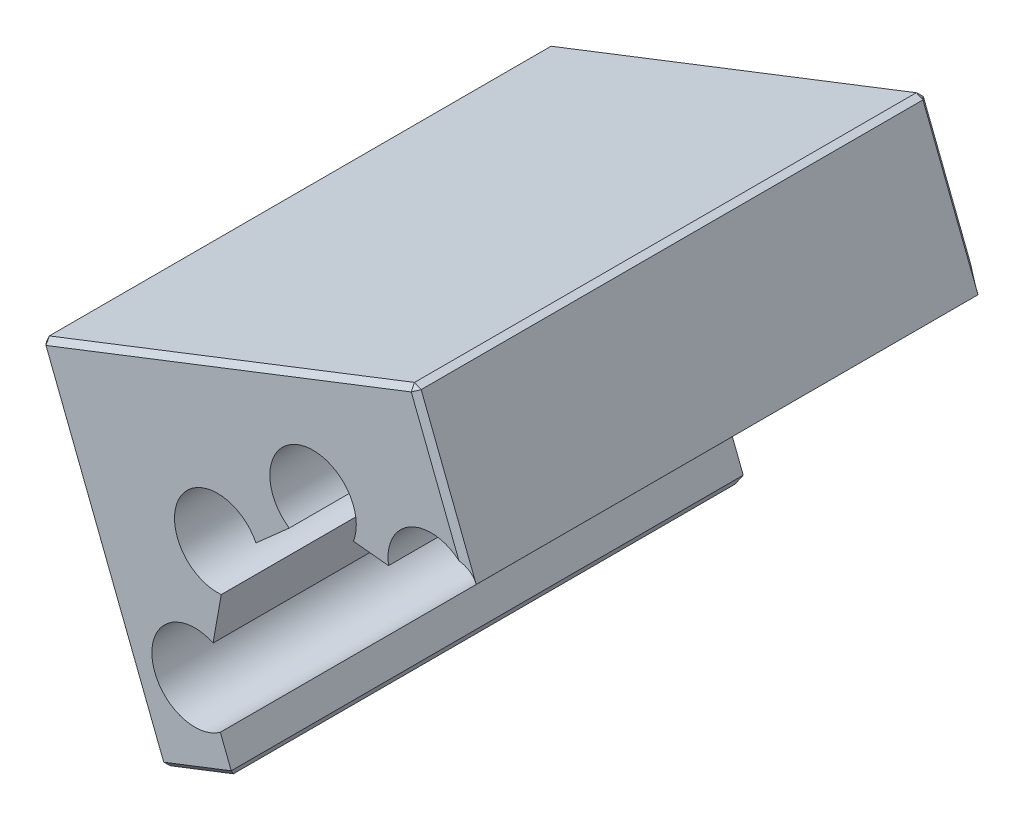
ISO-10303-21;
HEADER;
FILE_DESCRIPTION(('STEP AP214'),'2;1');
FILE_NAME('part.step','',(''),(''),'','','');
FILE_SCHEMA(('AUTOMOTIVE_DESIGN { 1 0 10303 214 1 1 1 1 }'));
ENDSEC;
DATA;
#1=APPLICATION_CONTEXT('core data for automotive mechanical design processes');
#2=APPLICATION_PROTOCOL_DEFINITION('international standard','automotive_design',2000,#1);
#3=PRODUCT_CONTEXT('',#1,'mechanical');
#4=PRODUCT('Part','Part','',(#3));
#5=PRODUCT_RELATED_PRODUCT_CATEGORY('part','',(#4));
#6=PRODUCT_DEFINITION_FORMATION('','',#4);
#7=PRODUCT_DEFINITION_CONTEXT('part definition',#1,'design');
#8=PRODUCT_DEFINITION('design','',#6,#7);
#9=PRODUCT_DEFINITION_SHAPE('','',#8);
#10=(LENGTH_UNIT() NAMED_UNIT(*) SI_UNIT(.MILLI.,.METRE.));
#11=(NAMED_UNIT(*) PLANE_ANGLE_UNIT() SI_UNIT($,.RADIAN.));
#12=(NAMED_UNIT(*) SI_UNIT($,.STERADIAN.) SOLID_ANGLE_UNIT());
#13=UNCERTAINTY_MEASURE_WITH_UNIT(LENGTH_MEASURE(1.E-05),#10,'distance_accuracy_value','');
#14=(GEOMETRIC_REPRESENTATION_CONTEXT(3) GLOBAL_UNCERTAINTY_ASSIGNED_CONTEXT((#13)) GLOBAL_UNIT_ASSIGNED_CONTEXT((#10,
#11,#12)) REPRESENTATION_CONTEXT('',''));
#15=CARTESIAN_POINT('',(0.,0.,0.));
#16=DIRECTION('',(0.,0.,1.));
#17=DIRECTION('',(1.,0.,0.));
#18=AXIS2_PLACEMENT_3D('',#15,#16,#17);
#19=CARTESIAN_POINT('',(-109.956011221457,-32.2462508840964,12577.7351284571));
#20=DIRECTION('',(0.,0.,1.));
#21=DIRECTION('',(1.,0.,0.));
#22=AXIS2_PLACEMENT_3D('',#19,#20,#21);
#23=CYLINDRICAL_SURFACE('',#22,21.);
#24=CARTESIAN_POINT('',(-109.956011221457,-32.2462508840964,12827.7351284571));
#25=DIRECTION('',(0.,0.,-1.));
#26=DIRECTION('',(1.,0.,0.));
#27=AXIS2_PLACEMENT_3D('',#24,#25,#26);
#28=CIRCLE('',#27,21.);
#29=CARTESIAN_POINT('',(-108.139732901133,-53.1675589948031,12827.7351284571));
#30=VERTEX_POINT('',#29);
#31=CARTESIAN_POINT('',(-91.1814690200371,-22.8379266376059,12827.7351284571));
#32=VERTEX_POINT('',#31);
#33=EDGE_CURVE('E213',#30,#32,#28,.T.);
#34=ORIENTED_EDGE('',*,*,#33,.F.);
#35=DIRECTION('',(0.,0.,1.));
#36=VECTOR('',#35,1.);
#37=CARTESIAN_POINT('',(-108.139732901133,-53.1675589948031,12577.7351284571));
#38=LINE('',#37,#36);
#39=CARTESIAN_POINT('',(-108.139732901133,-53.1675589948031,12577.7351284571));
#40=VERTEX_POINT('',#39);
#41=EDGE_CURVE('E193',#40,#30,#38,.T.);
#42=ORIENTED_EDGE('',*,*,#41,.F.);
#43=CARTESIAN_POINT('',(-109.956011221457,-32.2462508840964,12577.7351284571));
#44=DIRECTION('',(0.,0.,-1.));
#45=DIRECTION('',(1.,0.,0.));
#46=AXIS2_PLACEMENT_3D('',#43,#44,#45);
#47=CIRCLE('',#46,21.);
#48=CARTESIAN_POINT('',(-91.1814690200371,-22.8379266376059,12577.7351284571));
#49=VERTEX_POINT('',#48);
#50=EDGE_CURVE('E187',#40,#49,#47,.T.);
#51=ORIENTED_EDGE('',*,*,#50,.T.);
#52=DIRECTION('',(0.,0.,1.));
#53=VECTOR('',#52,1.);
#54=CARTESIAN_POINT('',(-91.1814690200371,-22.8379266376059,12577.7351284571));
#55=LINE('',#54,#53);
#56=EDGE_CURVE('E168',#49,#32,#55,.T.);
#57=ORIENTED_EDGE('',*,*,#56,.T.);
#58=EDGE_LOOP('',(#34,#42,#51,#57));
#59=FACE_BOUND('',#58,.T.);
#60=ADVANCED_FACE('F33',(#59),#23,.F.);
#61=CARTESIAN_POINT('',(-112.117770631375,-75.640230506587,12577.7351284571));
#62=DIRECTION('',(0.984691392589964,-0.174306802389456,0.));
#63=DIRECTION('',(0.174306802389456,0.984691392589964,0.));
#64=AXIS2_PLACEMENT_3D('',#61,#62,#63);
#65=PLANE('',#64);
#66=DIRECTION('',(0.174306802389456,0.984691392589964,0.));
#67=VECTOR('',#66,1.);
#68=CARTESIAN_POINT('',(-112.117770631375,-75.640230506587,12827.7351284571));
#69=LINE('',#68,#67);
#70=CARTESIAN_POINT('',(-112.117770631375,-75.640230506587,12827.7351284571));
#71=VERTEX_POINT('',#70);
#72=EDGE_CURVE('E194',#71,#30,#69,.T.);
#73=ORIENTED_EDGE('',*,*,#72,.F.);
#74=DIRECTION('',(0.,0.,1.));
#75=VECTOR('',#74,1.);
#76=CARTESIAN_POINT('',(-112.117770631375,-75.640230506587,12577.7351284571));
#77=LINE('',#76,#75);
#78=CARTESIAN_POINT('',(-112.117770631375,-75.640230506587,12577.7351284571));
#79=VERTEX_POINT('',#78);
#80=EDGE_CURVE('E231',#79,#71,#77,.T.);
#81=ORIENTED_EDGE('',*,*,#80,.F.);
#82=DIRECTION('',(0.174306802389456,0.984691392589964,0.));
#83=VECTOR('',#82,1.);
#84=CARTESIAN_POINT('',(-112.117770631375,-75.640230506587,12577.7351284571));
#85=LINE('',#84,#83);
#86=EDGE_CURVE('E179',#79,#40,#85,.T.);
#87=ORIENTED_EDGE('',*,*,#86,.T.);
#88=ORIENTED_EDGE('',*,*,#41,.T.);
#89=EDGE_LOOP('',(#73,#81,#87,#88));
#90=FACE_BOUND('',#89,.T.);
#91=ADVANCED_FACE('F394',(#90),#65,.T.);
#92=CARTESIAN_POINT('',(-121.005481520985,-94.6667539710225,12577.7351284571));
#93=DIRECTION('',(0.,0.,1.));
#94=DIRECTION('',(1.,0.,0.));
#95=AXIS2_PLACEMENT_3D('',#92,#93,#94);
#96=CYLINDRICAL_SURFACE('',#95,21.);
#97=CARTESIAN_POINT('',(-121.005481520985,-94.6667539710225,12827.7351284571));
#98=DIRECTION('',(0.,0.,-1.));
#99=DIRECTION('',(1.,0.,0.));
#100=AXIS2_PLACEMENT_3D('',#97,#98,#99);
#101=CIRCLE('',#100,21.);
#102=CARTESIAN_POINT('',(-108.575356239287,-111.592828101822,12827.7351284571));
#103=VERTEX_POINT('',#102);
#104=EDGE_CURVE('E197',#103,#71,#101,.T.);
#105=ORIENTED_EDGE('',*,*,#104,.F.);
#106=DIRECTION('',(0.,0.,1.));
#107=VECTOR('',#106,1.);
#108=CARTESIAN_POINT('',(-108.575356239287,-111.592828101822,12577.7351284571));
#109=LINE('',#108,#107);
#110=CARTESIAN_POINT('',(-108.575356239287,-111.592828101822,12577.7351284571));
#111=VERTEX_POINT('',#110);
#112=EDGE_CURVE('E233',#111,#103,#109,.T.);
#113=ORIENTED_EDGE('',*,*,#112,.F.);
#114=CARTESIAN_POINT('',(-121.005481520985,-94.6667539710225,12577.7351284571));
#115=DIRECTION('',(0.,0.,-1.));
#116=DIRECTION('',(1.,0.,0.));
#117=AXIS2_PLACEMENT_3D('',#114,#115,#116);
#118=CIRCLE('',#117,21.);
#119=EDGE_CURVE('E209',#111,#79,#118,.T.);
#120=ORIENTED_EDGE('',*,*,#119,.T.);
#121=ORIENTED_EDGE('',*,*,#80,.T.);
#122=EDGE_LOOP('',(#105,#113,#120,#121));
#123=FACE_BOUND('',#122,.T.);
#124=ADVANCED_FACE('F390',(#123),#96,.F.);
#125=CARTESIAN_POINT('',(-108.575356239287,-111.592828101822,12577.7351284571));
#126=DIRECTION('',(0.931737395073137,0.363132794749145,0.));
#127=DIRECTION('',(-0.363132794749145,0.931737395073137,0.));
#128=AXIS2_PLACEMENT_3D('',#125,#126,#127);
#129=PLANE('',#128);
#130=DIRECTION('',(-0.363132794749145,0.931737395073137,0.));
#131=VECTOR('',#130,1.);
#132=CARTESIAN_POINT('',(-108.575356239287,-111.592828101822,12827.7351284571));
#133=LINE('',#132,#131);
#134=CARTESIAN_POINT('',(-103.259247393131,-125.233065171749,12827.7351284571));
#135=VERTEX_POINT('',#134);
#136=EDGE_CURVE('E225',#135,#103,#133,.T.);
#137=ORIENTED_EDGE('',*,*,#136,.F.);
#138=DIRECTION('',(0.,0.,-1.));
#139=VECTOR('',#138,1.);
#140=CARTESIAN_POINT('',(-103.25924739313,-125.233065171749,12577.7351284571));
#141=LINE('',#140,#139);
#142=CARTESIAN_POINT('',(-103.25924739313,-125.233065171749,12577.7351284571));
#143=VERTEX_POINT('',#142);
#144=EDGE_CURVE('E288',#135,#143,#141,.T.);
#145=ORIENTED_EDGE('',*,*,#144,.T.);
#146=DIRECTION('',(-0.363132794749145,0.931737395073137,0.));
#147=VECTOR('',#146,1.);
#148=CARTESIAN_POINT('',(-108.575356239287,-111.592828101822,12577.7351284571));
#149=LINE('',#148,#147);
#150=EDGE_CURVE('E207',#143,#111,#149,.T.);
#151=ORIENTED_EDGE('',*,*,#150,.T.);
#152=ORIENTED_EDGE('',*,*,#112,.T.);
#153=EDGE_LOOP('',(#137,#145,#151,#152));
#154=FACE_BOUND('',#153,.T.);
#155=ADVANCED_FACE('F385',(#154),#129,.T.);
#156=CARTESIAN_POINT('',(-102.351415406258,-127.562408659431,12577.7351284571));
#157=DIRECTION('',(0.363132794749145,-0.931737395073137,0.));
#158=DIRECTION('',(0.931737395073137,0.363132794749145,0.));
#159=AXIS2_PLACEMENT_3D('',#156,#157,#158);
#160=PLANE('',#159);
#161=DIRECTION('',(0.931737395073137,0.363132794749145,0.));
#162=VECTOR('',#161,1.);
#163=CARTESIAN_POINT('',(-102.351415406258,-127.562408659431,12580.2351284571));
#164=LINE('',#163,#162);
#165=CARTESIAN_POINT('',(-135.309060727003,-140.407231585889,12580.2351284571));
#166=VERTEX_POINT('',#165);
#167=CARTESIAN_POINT('',(-104.680758893941,-128.470240646304,12580.2351284571));
#168=VERTEX_POINT('',#167);
#169=EDGE_CURVE('E283',#166,#168,#164,.T.);
#170=ORIENTED_EDGE('',*,*,#169,.T.);
#171=DIRECTION('',(0.,0.,1.));
#172=VECTOR('',#171,1.);
#173=CARTESIAN_POINT('',(-104.680758893941,-128.470240646304,12577.7351284571));
#174=LINE('',#173,#172);
#175=CARTESIAN_POINT('',(-104.680758893941,-128.470240646304,12825.2351284571));
#176=VERTEX_POINT('',#175);
#177=EDGE_CURVE('E285',#168,#176,#174,.T.);
#178=ORIENTED_EDGE('',*,*,#177,.T.);
#179=DIRECTION('',(-0.931737395073137,-0.363132794749145,0.));
#180=VECTOR('',#179,1.);
#181=CARTESIAN_POINT('',(-102.351415406258,-127.562408659431,12825.2351284571));
#182=LINE('',#181,#180);
#183=CARTESIAN_POINT('',(-135.309060727003,-140.407231585889,12825.2351284571));
#184=VERTEX_POINT('',#183);
#185=EDGE_CURVE('E279',#176,#184,#182,.T.);
#186=ORIENTED_EDGE('',*,*,#185,.T.);
#187=DIRECTION('',(0.,0.,-1.));
#188=VECTOR('',#187,1.);
#189=CARTESIAN_POINT('',(-135.309060727003,-140.407231585889,12577.7351284571));
#190=LINE('',#189,#188);
#191=EDGE_CURVE('E281',#184,#166,#190,.T.);
#192=ORIENTED_EDGE('',*,*,#191,.T.);
#193=EDGE_LOOP('',(#170,#178,#186,#192));
#194=FACE_BOUND('',#193,.T.);
#195=ADVANCED_FACE('F374',(#194),#160,.T.);
#196=CARTESIAN_POINT('',(-137.638404214685,-141.315063572762,12577.7351284571));
#197=DIRECTION('',(-0.931737395073137,-0.363132794749145,0.));
#198=DIRECTION('',(0.363132794749145,-0.931737395073137,0.));
#199=AXIS2_PLACEMENT_3D('',#196,#197,#198);
#200=PLANE('',#199);
#201=DIRECTION('',(0.,0.,-1.));
#202=VECTOR('',#201,1.);
#203=CARTESIAN_POINT('',(-196.025233475658,8.4956750573858,12577.7351284571));
#204=LINE('',#203,#202);
#205=CARTESIAN_POINT('',(-196.025233475658,8.49567505738577,12825.2351284571));
#206=VERTEX_POINT('',#205);
#207=CARTESIAN_POINT('',(-196.025233475658,8.49567505738576,12580.2351284571));
#208=VERTEX_POINT('',#207);
#209=EDGE_CURVE('E274',#206,#208,#204,.T.);
#210=ORIENTED_EDGE('',*,*,#209,.T.);
#211=DIRECTION('',(0.363132794749145,-0.931737395073137,0.));
#212=VECTOR('',#211,1.);
#213=CARTESIAN_POINT('',(-137.638404214685,-141.315063572762,12580.2351284571));
#214=LINE('',#213,#212);
#215=CARTESIAN_POINT('',(-138.546236201558,-138.985720085079,12580.2351284571));
#216=VERTEX_POINT('',#215);
#217=EDGE_CURVE('E276',#208,#216,#214,.T.);
#218=ORIENTED_EDGE('',*,*,#217,.T.);
#219=DIRECTION('',(0.,0.,1.));
#220=VECTOR('',#219,1.);
#221=CARTESIAN_POINT('',(-138.546236201558,-138.985720085079,12577.7351284571));
#222=LINE('',#221,#220);
#223=CARTESIAN_POINT('',(-138.546236201558,-138.985720085079,12825.2351284571));
#224=VERTEX_POINT('',#223);
#225=EDGE_CURVE('E272',#216,#224,#222,.T.);
#226=ORIENTED_EDGE('',*,*,#225,.T.);
#227=DIRECTION('',(-0.363132794749145,0.931737395073137,0.));
#228=VECTOR('',#227,1.);
#229=CARTESIAN_POINT('',(-137.638404214685,-141.315063572762,12825.2351284571));
#230=LINE('',#229,#228);
#231=EDGE_CURVE('E270',#224,#206,#230,.T.);
#232=ORIENTED_EDGE('',*,*,#231,.T.);
#233=EDGE_LOOP('',(#210,#218,#226,#232));
#234=FACE_BOUND('',#233,.T.);
#235=ADVANCED_FACE('F365',(#234),#200,.T.);
#236=CARTESIAN_POINT('',(-196.933065462531,10.8250185450681,12577.7351284571));
#237=DIRECTION('',(-0.363132794749144,0.931737395073138,0.));
#238=DIRECTION('',(-0.931737395073138,-0.363132794749144,0.));
#239=AXIS2_PLACEMENT_3D('',#236,#237,#238);
#240=PLANE('',#239);
#241=DIRECTION('',(0.,0.,-1.));
#242=VECTOR('',#241,1.);
#243=CARTESIAN_POINT('',(-16.258858059274,81.2404920683576,12577.7351284571));
#244=LINE('',#243,#242);
#245=CARTESIAN_POINT('',(-16.2588580592739,81.2404920683576,12825.2351284571));
#246=VERTEX_POINT('',#245);
#247=CARTESIAN_POINT('',(-16.2588580592739,81.2404920683576,12580.2351284571));
#248=VERTEX_POINT('',#247);
#249=EDGE_CURVE('E247',#246,#248,#244,.T.);
#250=ORIENTED_EDGE('',*,*,#249,.T.);
#251=DIRECTION('',(-0.931737395073138,-0.363132794749144,0.));
#252=VECTOR('',#251,1.);
#253=CARTESIAN_POINT('',(-196.933065462531,10.8250185450681,12580.2351284571));
#254=LINE('',#253,#252);
#255=CARTESIAN_POINT('',(-194.603721974848,11.7328505319409,12580.2351284571));
#256=VERTEX_POINT('',#255);
#257=EDGE_CURVE('E249',#248,#256,#254,.T.);
#258=ORIENTED_EDGE('',*,*,#257,.T.);
#259=DIRECTION('',(0.,0.,1.));
#260=VECTOR('',#259,1.);
#261=CARTESIAN_POINT('',(-194.603721974848,11.7328505319409,12577.7351284571));
#262=LINE('',#261,#260);
#263=CARTESIAN_POINT('',(-194.603721974848,11.7328505319409,12825.2351284571));
#264=VERTEX_POINT('',#263);
#265=EDGE_CURVE('E245',#256,#264,#262,.T.);
#266=ORIENTED_EDGE('',*,*,#265,.T.);
#267=DIRECTION('',(0.931737395073138,0.363132794749144,0.));
#268=VECTOR('',#267,1.);
#269=CARTESIAN_POINT('',(-196.933065462531,10.8250185450681,12825.2351284571));
#270=LINE('',#269,#268);
#271=EDGE_CURVE('E230',#264,#246,#270,.T.);
#272=ORIENTED_EDGE('',*,*,#271,.T.);
#273=EDGE_LOOP('',(#250,#258,#266,#272));
#274=FACE_BOUND('',#273,.T.);
#275=ADVANCED_FACE('F451',(#274),#240,.T.);
#276=CARTESIAN_POINT('',(13.8575829658257,10.8513267844628,12577.7351284571));
#277=DIRECTION('',(0.931737395073137,0.363132794749145,0.));
#278=DIRECTION('',(-0.363132794749145,0.931737395073137,0.));
#279=AXIS2_PLACEMENT_3D('',#276,#277,#278);
#280=PLANE('',#279);
#281=DIRECTION('',(0.,0.,1.));
#282=VECTOR('',#281,1.);
#283=CARTESIAN_POINT('',(13.8575829658257,10.8513267844628,12577.7351284571));
#284=LINE('',#283,#282);
#285=CARTESIAN_POINT('',(13.8575829658257,10.8513267844628,12580.2351284571));
#286=VERTEX_POINT('',#285);
#287=CARTESIAN_POINT('',(13.8575829658257,10.8513267844628,12825.2351284571));
#288=VERTEX_POINT('',#287);
#289=EDGE_CURVE('E236',#286,#288,#284,.T.);
#290=ORIENTED_EDGE('',*,*,#289,.F.);
#291=DIRECTION('',(-0.363132794749145,0.931737395073137,0.));
#292=VECTOR('',#291,1.);
#293=CARTESIAN_POINT('',(-13.9295145715912,82.1483240552304,12580.2351284571));
#294=LINE('',#293,#292);
#295=CARTESIAN_POINT('',(-13.0216825847185,79.8189805675481,12580.2351284571));
#296=VERTEX_POINT('',#295);
#297=EDGE_CURVE('E264',#286,#296,#294,.T.);
#298=ORIENTED_EDGE('',*,*,#297,.T.);
#299=DIRECTION('',(0.,0.,1.));
#300=VECTOR('',#299,1.);
#301=CARTESIAN_POINT('',(-13.0216825847185,79.8189805675481,12577.7351284571));
#302=LINE('',#301,#300);
#303=CARTESIAN_POINT('',(-13.0216825847185,79.8189805675481,12825.2351284571));
#304=VERTEX_POINT('',#303);
#305=EDGE_CURVE('E262',#296,#304,#302,.T.);
#306=ORIENTED_EDGE('',*,*,#305,.T.);
#307=DIRECTION('',(0.363132794749145,-0.931737395073137,0.));
#308=VECTOR('',#307,1.);
#309=CARTESIAN_POINT('',(13.8575829658257,10.8513267844628,12825.2351284571));
#310=LINE('',#309,#308);
#311=EDGE_CURVE('E260',#304,#288,#310,.T.);
#312=ORIENTED_EDGE('',*,*,#311,.T.);
#313=EDGE_LOOP('',(#290,#298,#306,#312));
#314=FACE_BOUND('',#313,.T.);
#315=ADVANCED_FACE('F446',(#314),#280,.T.);
#316=CARTESIAN_POINT('',(-5.70890233071021,3.22553809473078,12577.7351284571));
#317=DIRECTION('',(0.,0.,1.));
#318=DIRECTION('',(1.,0.,0.));
#319=AXIS2_PLACEMENT_3D('',#316,#317,#318);
#320=CYLINDRICAL_SURFACE('',#319,21.);
#321=CARTESIAN_POINT('',(-5.70890233071021,3.22553809473078,12577.7351284571));
#322=DIRECTION('',(0.,0.,-1.));
#323=DIRECTION('',(1.,0.,0.));
#324=AXIS2_PLACEMENT_3D('',#321,#322,#323);
#325=CIRCLE('',#324,21.);
#326=CARTESIAN_POINT('',(-26.4460123964801,-0.0869030172209947,12577.7351284571));
#327=VERTEX_POINT('',#326);
#328=CARTESIAN_POINT('',(7.91967870146834,19.2024520348302,12577.7351284571));
#329=VERTEX_POINT('',#328);
#330=EDGE_CURVE('E204',#327,#329,#325,.T.);
#331=ORIENTED_EDGE('',*,*,#330,.T.);
#332=CARTESIAN_POINT('',(-5.70890233071021,3.22553809473078,12559.2351284571));
#333=DIRECTION('',(0.658837830341249,0.256773661638321,-0.707106781186608));
#334=DIRECTION('',(0.658837830341361,0.256773661638365,0.707106781186487));
#335=AXIS2_PLACEMENT_3D('',#332,#333,#334);
#336=ELLIPSE('',#335,29.6984848098325,21.);
#337=EDGE_CURVE('E268',#329,#286,#336,.T.);
#338=ORIENTED_EDGE('',*,*,#337,.T.);
#339=ORIENTED_EDGE('',*,*,#289,.T.);
#340=CARTESIAN_POINT('',(-5.70890233071021,3.22553809473078,12846.2351284571));
#341=DIRECTION('',(-0.658837830341249,-0.256773661638321,-0.707106781186608));
#342=DIRECTION('',(-0.658837830341361,-0.256773661638365,0.707106781186487));
#343=AXIS2_PLACEMENT_3D('',#340,#341,#342);
#344=ELLIPSE('',#343,29.6984848098325,21.);
#345=CARTESIAN_POINT('',(7.91967870146834,19.2024520348302,12827.7351284571));
#346=VERTEX_POINT('',#345);
#347=EDGE_CURVE('E266',#288,#346,#344,.F.);
#348=ORIENTED_EDGE('',*,*,#347,.T.);
#349=CARTESIAN_POINT('',(-5.70890233071021,3.22553809473078,12827.7351284571));
#350=DIRECTION('',(0.,0.,-1.));
#351=DIRECTION('',(1.,0.,0.));
#352=AXIS2_PLACEMENT_3D('',#349,#350,#351);
#353=CIRCLE('',#352,21.);
#354=CARTESIAN_POINT('',(-26.4460123964801,-0.0869030172209947,12827.7351284571));
#355=VERTEX_POINT('',#354);
#356=EDGE_CURVE('E222',#355,#346,#353,.T.);
#357=ORIENTED_EDGE('',*,*,#356,.F.);
#358=DIRECTION('',(0.,0.,1.));
#359=VECTOR('',#358,1.);
#360=CARTESIAN_POINT('',(-26.4460123964801,-0.0869030172209947,12577.7351284571));
#361=LINE('',#360,#359);
#362=EDGE_CURVE('E239',#327,#355,#361,.T.);
#363=ORIENTED_EDGE('',*,*,#362,.F.);
#364=EDGE_LOOP('',(#331,#338,#339,#348,#357,#363));
#365=FACE_BOUND('',#364,.T.);
#366=ADVANCED_FACE('F404',(#365),#320,.F.);
#367=CARTESIAN_POINT('',(-43.5798748895795,1.66217030299279,12577.7351284571));
#368=DIRECTION('',(-0.101555062180964,-0.994829919808115,0.));
#369=DIRECTION('',(0.994829919808115,-0.101555062180964,0.));
#370=AXIS2_PLACEMENT_3D('',#367,#368,#369);
#371=PLANE('',#370);
#372=DIRECTION('',(0.994829919808115,-0.101555062180964,0.));
#373=VECTOR('',#372,1.);
#374=CARTESIAN_POINT('',(-43.5798748895795,1.66217030299279,12827.7351284571));
#375=LINE('',#374,#373);
#376=CARTESIAN_POINT('',(-43.5798748895795,1.66217030299279,12827.7351284571));
#377=VERTEX_POINT('',#376);
#378=EDGE_CURVE('E219',#377,#355,#375,.T.);
#379=ORIENTED_EDGE('',*,*,#378,.F.);
#380=DIRECTION('',(0.,0.,1.));
#381=VECTOR('',#380,1.);
#382=CARTESIAN_POINT('',(-43.5798748895795,1.66217030299279,12577.7351284571));
#383=LINE('',#382,#381);
#384=CARTESIAN_POINT('',(-43.5798748895795,1.66217030299279,12577.7351284571));
#385=VERTEX_POINT('',#384);
#386=EDGE_CURVE('E241',#385,#377,#383,.T.);
#387=ORIENTED_EDGE('',*,*,#386,.F.);
#388=DIRECTION('',(0.994829919808115,-0.101555062180964,0.));
#389=VECTOR('',#388,1.);
#390=CARTESIAN_POINT('',(-43.5798748895795,1.66217030299279,12577.7351284571));
#391=LINE('',#390,#389);
#392=EDGE_CURVE('E201',#385,#327,#391,.T.);
#393=ORIENTED_EDGE('',*,*,#392,.T.);
#394=ORIENTED_EDGE('',*,*,#362,.T.);
#395=EDGE_LOOP('',(#379,#387,#393,#394));
#396=FACE_BOUND('',#395,.T.);
#397=ADVANCED_FACE('F400',(#396),#371,.T.);
#398=CARTESIAN_POINT('',(-63.2988923019353,9.20180623385765,12577.7351284571));
#399=DIRECTION('',(0.,0.,1.));
#400=DIRECTION('',(1.,0.,0.));
#401=AXIS2_PLACEMENT_3D('',#398,#399,#400);
#402=CYLINDRICAL_SURFACE('',#401,21.1112708683959);
#403=CARTESIAN_POINT('',(-63.2988923019353,9.20180623385765,12827.7351284571));
#404=DIRECTION('',(0.,0.,-1.));
#405=DIRECTION('',(1.,0.,0.));
#406=AXIS2_PLACEMENT_3D('',#403,#404,#405);
#407=CIRCLE('',#406,21.1112708683959);
#408=CARTESIAN_POINT('',(-74.9151865024779,-8.42622447649749,12827.7351284571));
#409=VERTEX_POINT('',#408);
#410=EDGE_CURVE('E216',#409,#377,#407,.T.);
#411=ORIENTED_EDGE('',*,*,#410,.F.);
#412=DIRECTION('',(0.,0.,1.));
#413=VECTOR('',#412,1.);
#414=CARTESIAN_POINT('',(-74.9151865024779,-8.42622447649749,12577.7351284571));
#415=LINE('',#414,#413);
#416=CARTESIAN_POINT('',(-74.9151865024779,-8.42622447649749,12577.7351284571));
#417=VERTEX_POINT('',#416);
#418=EDGE_CURVE('E178',#417,#409,#415,.T.);
#419=ORIENTED_EDGE('',*,*,#418,.F.);
#420=CARTESIAN_POINT('',(-63.2988923019353,9.20180623385765,12577.7351284571));
#421=DIRECTION('',(0.,0.,-1.));
#422=DIRECTION('',(1.,0.,0.));
#423=AXIS2_PLACEMENT_3D('',#420,#421,#422);
#424=CIRCLE('',#423,21.1112708683959);
#425=EDGE_CURVE('E191',#417,#385,#424,.T.);
#426=ORIENTED_EDGE('',*,*,#425,.T.);
#427=ORIENTED_EDGE('',*,*,#386,.T.);
#428=EDGE_LOOP('',(#411,#419,#426,#427));
#429=FACE_BOUND('',#428,.T.);
#430=ADVANCED_FACE('F398',(#429),#402,.F.);
#431=CARTESIAN_POINT('',(-91.1814690200371,-22.8379266376059,12577.7351284571));
#432=DIRECTION('',(0.663149297828435,-0.748487146709717,0.));
#433=DIRECTION('',(0.748487146709717,0.663149297828435,0.));
#434=AXIS2_PLACEMENT_3D('',#431,#432,#433);
#435=PLANE('',#434);
#436=DIRECTION('',(0.748487146709717,0.663149297828435,0.));
#437=VECTOR('',#436,1.);
#438=CARTESIAN_POINT('',(-91.1814690200371,-22.8379266376059,12827.7351284571));
#439=LINE('',#438,#437);
#440=EDGE_CURVE('E173',#32,#409,#439,.T.);
#441=ORIENTED_EDGE('',*,*,#440,.F.);
#442=ORIENTED_EDGE('',*,*,#56,.F.);
#443=DIRECTION('',(0.748487146709717,0.663149297828435,0.));
#444=VECTOR('',#443,1.);
#445=CARTESIAN_POINT('',(-91.1814690200371,-22.8379266376059,12577.7351284571));
#446=LINE('',#445,#444);
#447=EDGE_CURVE('E171',#49,#417,#446,.T.);
#448=ORIENTED_EDGE('',*,*,#447,.T.);
#449=ORIENTED_EDGE('',*,*,#418,.T.);
#450=EDGE_LOOP('',(#441,#442,#448,#449));
#451=FACE_BOUND('',#450,.T.);
#452=ADVANCED_FACE('F170',(#451),#435,.T.);
#453=CARTESIAN_POINT('',(-109.956011221457,-32.2462508840964,12577.7351284571));
#454=DIRECTION('',(0.,0.,1.));
#455=DIRECTION('',(1.,0.,0.));
#456=AXIS2_PLACEMENT_3D('',#453,#454,#455);
#457=PLANE('',#456);
#458=DIRECTION('',(0.931737395073138,0.363132794749144,0.));
#459=VECTOR('',#458,1.);
#460=CARTESIAN_POINT('',(-13.0216825847185,79.8189805675481,12577.7351284571));
#461=LINE('',#460,#459);
#462=CARTESIAN_POINT('',(-193.695889987976,9.40350704425842,12577.7351284571));
#463=VERTEX_POINT('',#462);
#464=CARTESIAN_POINT('',(-15.3510260724013,78.9111485806752,12577.7351284571));
#465=VERTEX_POINT('',#464);
#466=EDGE_CURVE('E256',#463,#465,#461,.T.);
#467=ORIENTED_EDGE('',*,*,#466,.T.);
#468=DIRECTION('',(0.363132794749145,-0.931737395073137,0.));
#469=VECTOR('',#468,1.);
#470=CARTESIAN_POINT('',(11.5282394781429,9.94349479758998,12577.7351284571));
#471=LINE('',#470,#469);
#472=EDGE_CURVE('E258',#465,#329,#471,.T.);
#473=ORIENTED_EDGE('',*,*,#472,.T.);
#474=ORIENTED_EDGE('',*,*,#330,.F.);
#475=ORIENTED_EDGE('',*,*,#392,.F.);
#476=ORIENTED_EDGE('',*,*,#425,.F.);
#477=ORIENTED_EDGE('',*,*,#447,.F.);
#478=ORIENTED_EDGE('',*,*,#50,.F.);
#479=ORIENTED_EDGE('',*,*,#86,.F.);
#480=ORIENTED_EDGE('',*,*,#119,.F.);
#481=ORIENTED_EDGE('',*,*,#150,.F.);
#482=DIRECTION('',(-0.931737395073137,-0.363132794749145,0.));
#483=VECTOR('',#482,1.);
#484=CARTESIAN_POINT('',(-138.546236201558,-138.985720085079,12577.7351284571));
#485=LINE('',#484,#483);
#486=CARTESIAN_POINT('',(-136.216892713876,-138.077888098207,12577.7351284571));
#487=VERTEX_POINT('',#486);
#488=EDGE_CURVE('E252',#143,#487,#485,.T.);
#489=ORIENTED_EDGE('',*,*,#488,.T.);
#490=DIRECTION('',(-0.363132794749145,0.931737395073137,0.));
#491=VECTOR('',#490,1.);
#492=CARTESIAN_POINT('',(-194.603721974849,11.7328505319408,12577.7351284571));
#493=LINE('',#492,#491);
#494=EDGE_CURVE('E254',#487,#463,#493,.T.);
#495=ORIENTED_EDGE('',*,*,#494,.T.);
#496=EDGE_LOOP('',(#467,#473,#474,#475,#476,#477,#478,#479,#480,#481,#489,#495));
#497=FACE_BOUND('',#496,.T.);
#498=ADVANCED_FACE('F185',(#497),#457,.F.);
#499=CARTESIAN_POINT('',(-109.956011221457,-32.2462508840964,12827.7351284571));
#500=DIRECTION('',(0.,0.,1.));
#501=DIRECTION('',(1.,0.,0.));
#502=AXIS2_PLACEMENT_3D('',#499,#500,#501);
#503=PLANE('',#502);
#504=DIRECTION('',(0.363132794749145,-0.931737395073137,0.));
#505=VECTOR('',#504,1.);
#506=CARTESIAN_POINT('',(-168.561532615901,-55.08700717898,12827.7351284571));
#507=LINE('',#506,#505);
#508=CARTESIAN_POINT('',(-193.695889987975,9.40350704425817,12827.7351284571));
#509=VERTEX_POINT('',#508);
#510=CARTESIAN_POINT('',(-136.216892713875,-138.077888098206,12827.7351284571));
#511=VERTEX_POINT('',#510);
#512=EDGE_CURVE('E42',#509,#511,#507,.T.);
#513=ORIENTED_EDGE('',*,*,#512,.T.);
#514=DIRECTION('',(0.931737395073137,0.363132794749145,0.));
#515=VECTOR('',#514,1.);
#516=CARTESIAN_POINT('',(-77.6113713194314,-115.237131803322,12827.7351284571));
#517=LINE('',#516,#515);
#518=EDGE_CURVE('E11',#511,#135,#517,.T.);
#519=ORIENTED_EDGE('',*,*,#518,.T.);
#520=ORIENTED_EDGE('',*,*,#136,.T.);
#521=ORIENTED_EDGE('',*,*,#104,.T.);
#522=ORIENTED_EDGE('',*,*,#72,.T.);
#523=ORIENTED_EDGE('',*,*,#33,.T.);
#524=ORIENTED_EDGE('',*,*,#440,.T.);
#525=ORIENTED_EDGE('',*,*,#410,.T.);
#526=ORIENTED_EDGE('',*,*,#378,.T.);
#527=ORIENTED_EDGE('',*,*,#356,.T.);
#528=DIRECTION('',(-0.363132794749145,0.931737395073137,0.));
#529=VECTOR('',#528,1.);
#530=CARTESIAN_POINT('',(9.78333129967329,14.4206343574367,12827.7351284571));
#531=LINE('',#530,#529);
#532=CARTESIAN_POINT('',(-15.3510260724011,78.9111485806748,12827.7351284571));
#533=VERTEX_POINT('',#532);
#534=EDGE_CURVE('E290',#346,#533,#531,.T.);
#535=ORIENTED_EDGE('',*,*,#534,.T.);
#536=DIRECTION('',(-0.931737395073138,-0.363132794749144,0.));
#537=VECTOR('',#536,1.);
#538=CARTESIAN_POINT('',(-135.090368593531,32.2442633391417,12827.7351284571));
#539=LINE('',#538,#537);
#540=EDGE_CURVE('E53',#533,#509,#539,.T.);
#541=ORIENTED_EDGE('',*,*,#540,.T.);
#542=EDGE_LOOP('',(#513,#519,#520,#521,#522,#523,#524,#525,#526,#527,#535,#541));
#543=FACE_BOUND('',#542,.T.);
#544=ADVANCED_FACE('F392',(#543),#503,.T.);
#545=CARTESIAN_POINT('',(-77.6113713194314,-115.237131803322,12827.7351284571));
#546=DIRECTION('',(-0.256773661638322,0.658837830341251,-0.707106781186605));
#547=DIRECTION('',(0.931737395073137,0.363132794749145,0.));
#548=AXIS2_PLACEMENT_3D('',#545,#546,#547);
#549=PLANE('',#548);
#550=DIRECTION('',(0.256773661638257,-0.6588378303414,-0.70710678118649));
#551=VECTOR('',#550,1.);
#552=CARTESIAN_POINT('',(-135.762976720439,-139.242559842047,12826.4851284571));
#553=LINE('',#552,#551);
#554=EDGE_CURVE('E37',#184,#511,#553,.F.);
#555=ORIENTED_EDGE('',*,*,#554,.F.);
#556=ORIENTED_EDGE('',*,*,#185,.F.);
#557=DIRECTION('',(0.328284019059607,0.747593652659551,0.57735026918953));
#558=VECTOR('',#557,1.);
#559=CARTESIAN_POINT('',(-98.041933158037,-113.351795357704,12836.9107739445));
#560=LINE('',#559,#558);
#561=EDGE_CURVE('E344',#135,#176,#560,.F.);
#562=ORIENTED_EDGE('',*,*,#561,.F.);
#563=ORIENTED_EDGE('',*,*,#518,.F.);
#564=EDGE_LOOP('',(#555,#556,#562,#563));
#565=FACE_BOUND('',#564,.T.);
#566=ADVANCED_FACE('F35',(#565),#549,.F.);
#567=CARTESIAN_POINT('',(-138.546236201558,-138.985720085079,12825.2351284571));
#568=DIRECTION('',(-0.32828401905955,-0.747593652659429,0.57735026918972));
#569=DIRECTION('',(0.,-0.611224928557175,-0.791456939264718));
#570=AXIS2_PLACEMENT_3D('',#567,#568,#569);
#571=PLANE('',#570);
#572=DIRECTION('',(-0.915611491979615,0.402064168703035,0.));
#573=VECTOR('',#572,1.);
#574=CARTESIAN_POINT('',(-138.546236201558,-138.985720085079,12825.2351284571));
#575=LINE('',#574,#573);
#576=EDGE_CURVE('E339',#184,#224,#575,.T.);
#577=ORIENTED_EDGE('',*,*,#576,.F.);
#578=ORIENTED_EDGE('',*,*,#554,.T.);
#579=DIRECTION('',(0.658837830341355,0.256773661638368,0.707106781186492));
#580=VECTOR('',#579,1.);
#581=CARTESIAN_POINT('',(-138.546236201558,-138.985720085079,12825.2351284571));
#582=LINE('',#581,#580);
#583=EDGE_CURVE('E342',#224,#511,#582,.T.);
#584=ORIENTED_EDGE('',*,*,#583,.F.);
#585=EDGE_LOOP('',(#577,#578,#584));
#586=FACE_BOUND('',#585,.T.);
#587=ADVANCED_FACE('F355',(#586),#571,.T.);
#588=CARTESIAN_POINT('',(-104.680758893941,-128.470240646304,12577.7351284571));
#589=DIRECTION('',(-0.915611491979614,0.402064168703039,0.));
#590=DIRECTION('',(0.,0.,1.));
#591=AXIS2_PLACEMENT_3D('',#588,#589,#590);
#592=PLANE('',#591);
#593=ORIENTED_EDGE('',*,*,#561,.T.);
#594=ORIENTED_EDGE('',*,*,#177,.F.);
#595=DIRECTION('',(0.328284019059589,0.747593652659509,-0.577350269189594));
#596=VECTOR('',#595,1.);
#597=CARTESIAN_POINT('',(-104.206921727004,-127.391182154786,12579.4017951238));
#598=LINE('',#597,#596);
#599=EDGE_CURVE('E336',#143,#168,#598,.F.);
#600=ORIENTED_EDGE('',*,*,#599,.F.);
#601=ORIENTED_EDGE('',*,*,#144,.F.);
#602=EDGE_LOOP('',(#593,#594,#600,#601));
#603=FACE_BOUND('',#602,.T.);
#604=ADVANCED_FACE('F381',(#603),#592,.F.);
#605=CARTESIAN_POINT('',(9.78333129967329,14.4206343574367,12827.7351284571));
#606=DIRECTION('',(-0.658837830341249,-0.256773661638321,-0.707106781186608));
#607=DIRECTION('',(-0.363132794749145,0.931737395073137,0.));
#608=AXIS2_PLACEMENT_3D('',#605,#606,#607);
#609=PLANE('',#608);
#610=ORIENTED_EDGE('',*,*,#347,.F.);
#611=ORIENTED_EDGE('',*,*,#311,.F.);
#612=DIRECTION('',(-0.65883783034132,-0.25677366163847,0.707106781186487));
#613=VECTOR('',#612,1.);
#614=CARTESIAN_POINT('',(-13.0216825847185,79.8189805675481,12825.2351284571));
#615=LINE('',#614,#613);
#616=EDGE_CURVE('E333',#533,#304,#615,.F.);
#617=ORIENTED_EDGE('',*,*,#616,.F.);
#618=ORIENTED_EDGE('',*,*,#534,.F.);
#619=EDGE_LOOP('',(#610,#611,#617,#618));
#620=FACE_BOUND('',#619,.T.);
#621=ADVANCED_FACE('F409',(#620),#609,.F.);
#622=CARTESIAN_POINT('',(-135.090368593531,32.2442633391418,12827.7351284571));
#623=DIRECTION('',(0.256773661638322,-0.658837830341251,-0.707106781186605));
#624=DIRECTION('',(-0.931737395073138,-0.363132794749144,0.));
#625=AXIS2_PLACEMENT_3D('',#622,#623,#624);
#626=PLANE('',#625);
#627=DIRECTION('',(0.256773661638366,-0.658837830341357,0.70710678118649));
#628=VECTOR('',#627,1.);
#629=CARTESIAN_POINT('',(-194.603721974848,11.7328505319409,12825.2351284571));
#630=LINE('',#629,#628);
#631=EDGE_CURVE('E327',#509,#264,#630,.F.);
#632=ORIENTED_EDGE('',*,*,#631,.F.);
#633=ORIENTED_EDGE('',*,*,#540,.F.);
#634=DIRECTION('',(-0.25677366163836,0.65883783034136,-0.70710678118649));
#635=VECTOR('',#634,1.);
#636=CARTESIAN_POINT('',(-15.8049420658375,80.0758203245162,12826.4851284571));
#637=LINE('',#636,#635);
#638=EDGE_CURVE('E330',#246,#533,#637,.F.);
#639=ORIENTED_EDGE('',*,*,#638,.F.);
#640=ORIENTED_EDGE('',*,*,#271,.F.);
#641=EDGE_LOOP('',(#632,#633,#639,#640));
#642=FACE_BOUND('',#641,.T.);
#643=ADVANCED_FACE('F418',(#642),#626,.F.);
#644=CARTESIAN_POINT('',(-168.561532615901,-55.08700717898,12827.7351284571));
#645=DIRECTION('',(0.658837830341253,0.256773661638323,-0.707106781186603));
#646=DIRECTION('',(0.363132794749145,-0.931737395073137,0.));
#647=AXIS2_PLACEMENT_3D('',#644,#645,#646);
#648=PLANE('',#647);
#649=ORIENTED_EDGE('',*,*,#583,.T.);
#650=ORIENTED_EDGE('',*,*,#512,.F.);
#651=DIRECTION('',(-0.658837830341406,-0.256773661638237,-0.707106781186492));
#652=VECTOR('',#651,1.);
#653=CARTESIAN_POINT('',(-194.860561731817,8.94959105082195,12826.4851284571));
#654=LINE('',#653,#652);
#655=EDGE_CURVE('E324',#206,#509,#654,.F.);
#656=ORIENTED_EDGE('',*,*,#655,.F.);
#657=ORIENTED_EDGE('',*,*,#231,.F.);
#658=EDGE_LOOP('',(#649,#650,#656,#657));
#659=FACE_BOUND('',#658,.T.);
#660=ADVANCED_FACE('F360',(#659),#648,.F.);
#661=CARTESIAN_POINT('',(-138.546236201558,-138.985720085079,12577.7351284571));
#662=DIRECTION('',(0.402064168703035,0.915611491979615,0.));
#663=DIRECTION('',(0.,0.,1.));
#664=AXIS2_PLACEMENT_3D('',#661,#662,#663);
#665=PLANE('',#664);
#666=ORIENTED_EDGE('',*,*,#576,.T.);
#667=ORIENTED_EDGE('',*,*,#225,.F.);
#668=DIRECTION('',(0.915611491979615,-0.402064168703035,0.));
#669=VECTOR('',#668,1.);
#670=CARTESIAN_POINT('',(-138.546236201558,-138.985720085079,12580.2351284571));
#671=LINE('',#670,#669);
#672=EDGE_CURVE('E321',#166,#216,#671,.F.);
#673=ORIENTED_EDGE('',*,*,#672,.F.);
#674=ORIENTED_EDGE('',*,*,#191,.F.);
#675=EDGE_LOOP('',(#666,#667,#673,#674));
#676=FACE_BOUND('',#675,.T.);
#677=ADVANCED_FACE('F371',(#676),#665,.F.);
#678=CARTESIAN_POINT('',(-102.351415406258,-127.562408659431,12580.2351284571));
#679=DIRECTION('',(0.256773661638344,-0.658837830341305,-0.707106781186547));
#680=DIRECTION('',(-0.931737395073137,-0.363132794749145,0.));
#681=AXIS2_PLACEMENT_3D('',#678,#679,#680);
#682=PLANE('',#681);
#683=ORIENTED_EDGE('',*,*,#599,.T.);
#684=ORIENTED_EDGE('',*,*,#169,.F.);
#685=DIRECTION('',(0.256773661638336,-0.658837830341307,0.707106781186548));
#686=VECTOR('',#685,1.);
#687=CARTESIAN_POINT('',(-135.762976720439,-139.242559842048,12578.9851284571));
#688=LINE('',#687,#686);
#689=EDGE_CURVE('E318',#487,#166,#688,.T.);
#690=ORIENTED_EDGE('',*,*,#689,.F.);
#691=ORIENTED_EDGE('',*,*,#488,.F.);
#692=EDGE_LOOP('',(#683,#684,#690,#691));
#693=FACE_BOUND('',#692,.T.);
#694=ADVANCED_FACE('F377',(#693),#682,.T.);
#695=CARTESIAN_POINT('',(-13.0216825847185,79.8189805675481,12825.2351284571));
#696=DIRECTION('',(0.328284019059429,0.747593652659481,0.577350269189722));
#697=DIRECTION('',(0.,-0.61122492855715,0.791456939264738));
#698=AXIS2_PLACEMENT_3D('',#695,#696,#697);
#699=PLANE('',#698);
#700=ORIENTED_EDGE('',*,*,#638,.T.);
#701=ORIENTED_EDGE('',*,*,#616,.T.);
#702=DIRECTION('',(0.91561149197968,-0.402064168702889,0.));
#703=VECTOR('',#702,1.);
#704=CARTESIAN_POINT('',(-13.0216825847185,79.8189805675481,12825.2351284571));
#705=LINE('',#704,#703);
#706=EDGE_CURVE('E315',#246,#304,#705,.T.);
#707=ORIENTED_EDGE('',*,*,#706,.F.);
#708=EDGE_LOOP('',(#700,#701,#707));
#709=FACE_BOUND('',#708,.T.);
#710=ADVANCED_FACE('F414',(#709),#699,.T.);
#711=CARTESIAN_POINT('',(-194.603721974848,11.7328505319409,12825.2351284571));
#712=DIRECTION('',(-0.747593652659422,0.328284019059557,0.577350269189725));
#713=DIRECTION('',(0.611224928557182,0.,0.791456939264713));
#714=AXIS2_PLACEMENT_3D('',#711,#712,#713);
#715=PLANE('',#714);
#716=ORIENTED_EDGE('',*,*,#655,.T.);
#717=ORIENTED_EDGE('',*,*,#631,.T.);
#718=DIRECTION('',(0.402064168703044,0.915611491979612,0.));
#719=VECTOR('',#718,1.);
#720=CARTESIAN_POINT('',(-194.603721974848,11.7328505319409,12825.2351284571));
#721=LINE('',#720,#719);
#722=EDGE_CURVE('E312',#206,#264,#721,.T.);
#723=ORIENTED_EDGE('',*,*,#722,.F.);
#724=EDGE_LOOP('',(#716,#717,#723));
#725=FACE_BOUND('',#724,.T.);
#726=ADVANCED_FACE('F420',(#725),#715,.T.);
#727=CARTESIAN_POINT('',(-138.546236201558,-138.985720085079,12580.2351284571));
#728=DIRECTION('',(-0.328284019059585,-0.747593652659508,-0.577350269189598));
#729=DIRECTION('',(0.,0.611224928557054,-0.791456939264812));
#730=AXIS2_PLACEMENT_3D('',#727,#728,#729);
#731=PLANE('',#730);
#732=ORIENTED_EDGE('',*,*,#689,.T.);
#733=ORIENTED_EDGE('',*,*,#672,.T.);
#734=DIRECTION('',(0.658837830341345,0.256773661638242,-0.707106781186546));
#735=VECTOR('',#734,1.);
#736=CARTESIAN_POINT('',(-138.546236201558,-138.985720085079,12580.2351284571));
#737=LINE('',#736,#735);
#738=EDGE_CURVE('E310',#487,#216,#737,.F.);
#739=ORIENTED_EDGE('',*,*,#738,.F.);
#740=EDGE_LOOP('',(#732,#733,#739));
#741=FACE_BOUND('',#740,.T.);
#742=ADVANCED_FACE('F485',(#741),#731,.T.);
#743=CARTESIAN_POINT('',(13.8575829658257,10.8513267844628,12580.2351284571));
#744=DIRECTION('',(0.658837830341249,0.256773661638321,-0.707106781186608));
#745=DIRECTION('',(0.363132794749145,-0.931737395073137,0.));
#746=AXIS2_PLACEMENT_3D('',#743,#744,#745);
#747=PLANE('',#746);
#748=ORIENTED_EDGE('',*,*,#337,.F.);
#749=ORIENTED_EDGE('',*,*,#472,.F.);
#750=DIRECTION('',(-0.658837830341361,-0.256773661638364,-0.707106781186487));
#751=VECTOR('',#750,1.);
#752=CARTESIAN_POINT('',(-15.3510260724013,78.9111485806752,12577.7351284571));
#753=LINE('',#752,#751);
#754=EDGE_CURVE('E307',#296,#465,#753,.T.);
#755=ORIENTED_EDGE('',*,*,#754,.F.);
#756=ORIENTED_EDGE('',*,*,#297,.F.);
#757=EDGE_LOOP('',(#748,#749,#755,#756));
#758=FACE_BOUND('',#757,.T.);
#759=ADVANCED_FACE('F443',(#758),#747,.T.);
#760=CARTESIAN_POINT('',(-13.0216825847185,79.8189805675481,12577.7351284571));
#761=DIRECTION('',(-0.402064168702889,-0.91561149197968,0.));
#762=DIRECTION('',(0.,0.,1.));
#763=AXIS2_PLACEMENT_3D('',#760,#761,#762);
#764=PLANE('',#763);
#765=ORIENTED_EDGE('',*,*,#706,.T.);
#766=ORIENTED_EDGE('',*,*,#305,.F.);
#767=DIRECTION('',(-0.91561149197968,0.402064168702889,0.));
#768=VECTOR('',#767,1.);
#769=CARTESIAN_POINT('',(-14.6402703219965,80.529736317953,12580.2351284571));
#770=LINE('',#769,#768);
#771=EDGE_CURVE('E304',#248,#296,#770,.F.);
#772=ORIENTED_EDGE('',*,*,#771,.F.);
#773=ORIENTED_EDGE('',*,*,#249,.F.);
#774=EDGE_LOOP('',(#765,#766,#772,#773));
#775=FACE_BOUND('',#774,.T.);
#776=ADVANCED_FACE('F449',(#775),#764,.F.);
#777=CARTESIAN_POINT('',(-194.603721974848,11.7328505319409,12577.7351284571));
#778=DIRECTION('',(0.915611491979612,-0.402064168703044,0.));
#779=DIRECTION('',(0.,0.,1.));
#780=AXIS2_PLACEMENT_3D('',#777,#778,#779);
#781=PLANE('',#780);
#782=ORIENTED_EDGE('',*,*,#722,.T.);
#783=ORIENTED_EDGE('',*,*,#265,.F.);
#784=DIRECTION('',(-0.402064168703044,-0.915611491979611,0.));
#785=VECTOR('',#784,1.);
#786=CARTESIAN_POINT('',(-194.603721974848,11.7328505319409,12580.2351284571));
#787=LINE('',#786,#785);
#788=EDGE_CURVE('E301',#208,#256,#787,.F.);
#789=ORIENTED_EDGE('',*,*,#788,.F.);
#790=ORIENTED_EDGE('',*,*,#209,.F.);
#791=EDGE_LOOP('',(#782,#783,#789,#790));
#792=FACE_BOUND('',#791,.T.);
#793=ADVANCED_FACE('F424',(#792),#781,.F.);
#794=CARTESIAN_POINT('',(-137.638404214685,-141.315063572762,12580.2351284571));
#795=DIRECTION('',(-0.658837830341304,-0.256773661638342,-0.707106781186549));
#796=DIRECTION('',(-0.363132794749145,0.931737395073137,0.));
#797=AXIS2_PLACEMENT_3D('',#794,#795,#796);
#798=PLANE('',#797);
#799=ORIENTED_EDGE('',*,*,#738,.T.);
#800=ORIENTED_EDGE('',*,*,#217,.F.);
#801=DIRECTION('',(-0.658837830341313,-0.256773661638324,0.707106781186547));
#802=VECTOR('',#801,1.);
#803=CARTESIAN_POINT('',(-194.860561731817,8.94959105082214,12578.9851284571));
#804=LINE('',#803,#802);
#805=EDGE_CURVE('E298',#463,#208,#804,.T.);
#806=ORIENTED_EDGE('',*,*,#805,.F.);
#807=ORIENTED_EDGE('',*,*,#494,.F.);
#808=EDGE_LOOP('',(#799,#800,#806,#807));
#809=FACE_BOUND('',#808,.T.);
#810=ADVANCED_FACE('F432',(#809),#798,.T.);
#811=CARTESIAN_POINT('',(-15.3510260724013,78.9111485806752,12577.7351284571));
#812=DIRECTION('',(0.328284019059447,0.747593652659521,-0.57735026918966));
#813=DIRECTION('',(0.,0.611224928557088,0.791456939264786));
#814=AXIS2_PLACEMENT_3D('',#811,#812,#813);
#815=PLANE('',#814);
#816=ORIENTED_EDGE('',*,*,#771,.T.);
#817=ORIENTED_EDGE('',*,*,#754,.T.);
#818=DIRECTION('',(-0.256773661638341,0.658837830341307,0.707106781186546));
#819=VECTOR('',#818,1.);
#820=CARTESIAN_POINT('',(-15.3510260724013,78.9111485806752,12577.7351284571));
#821=LINE('',#820,#819);
#822=EDGE_CURVE('E296',#248,#465,#821,.F.);
#823=ORIENTED_EDGE('',*,*,#822,.F.);
#824=EDGE_LOOP('',(#816,#817,#823));
#825=FACE_BOUND('',#824,.T.);
#826=ADVANCED_FACE('F473',(#825),#815,.T.);
#827=CARTESIAN_POINT('',(-194.603721974848,11.7328505319409,12580.2351284571));
#828=DIRECTION('',(-0.747593652659501,0.328284019059591,-0.577350269189603));
#829=DIRECTION('',(-0.611224928557061,0.,0.791456939264807));
#830=AXIS2_PLACEMENT_3D('',#827,#828,#829);
#831=PLANE('',#830);
#832=ORIENTED_EDGE('',*,*,#805,.T.);
#833=ORIENTED_EDGE('',*,*,#788,.T.);
#834=DIRECTION('',(0.256773661638242,-0.658837830341346,-0.707106781186546));
#835=VECTOR('',#834,1.);
#836=CARTESIAN_POINT('',(-194.603721974848,11.7328505319409,12580.2351284571));
#837=LINE('',#836,#835);
#838=EDGE_CURVE('E294',#463,#256,#837,.F.);
#839=ORIENTED_EDGE('',*,*,#838,.F.);
#840=EDGE_LOOP('',(#832,#833,#839));
#841=FACE_BOUND('',#840,.T.);
#842=ADVANCED_FACE('F428',(#841),#831,.T.);
#843=CARTESIAN_POINT('',(-196.933065462531,10.8250185450681,12580.2351284571));
#844=DIRECTION('',(-0.256773661638342,0.658837830341303,-0.707106781186549));
#845=DIRECTION('',(0.931737395073138,0.363132794749144,0.));
#846=AXIS2_PLACEMENT_3D('',#843,#844,#845);
#847=PLANE('',#846);
#848=ORIENTED_EDGE('',*,*,#822,.T.);
#849=ORIENTED_EDGE('',*,*,#466,.F.);
#850=ORIENTED_EDGE('',*,*,#838,.T.);
#851=ORIENTED_EDGE('',*,*,#257,.F.);
#852=EDGE_LOOP('',(#848,#849,#850,#851));
#853=FACE_BOUND('',#852,.T.);
#854=ADVANCED_FACE('F434',(#853),#847,.T.);
#855=CLOSED_SHELL('',(#60,#91,#124,#155,#195,#235,#275,#315,#366,#397,#430,#452,#498,#544,#566,
#587,#604,#621,#643,#660,#677,#694,#710,#726,#742,#759,#776,#793,#810,#826,#842,#854));
#856=MANIFOLD_SOLID_BREP('B2',#855);
#857=ADVANCED_BREP_SHAPE_REPRESENTATION('',(#18,#856),#14);
#858=SHAPE_DEFINITION_REPRESENTATION(#9,#857);
ENDSEC;
END-ISO-10303-21;
